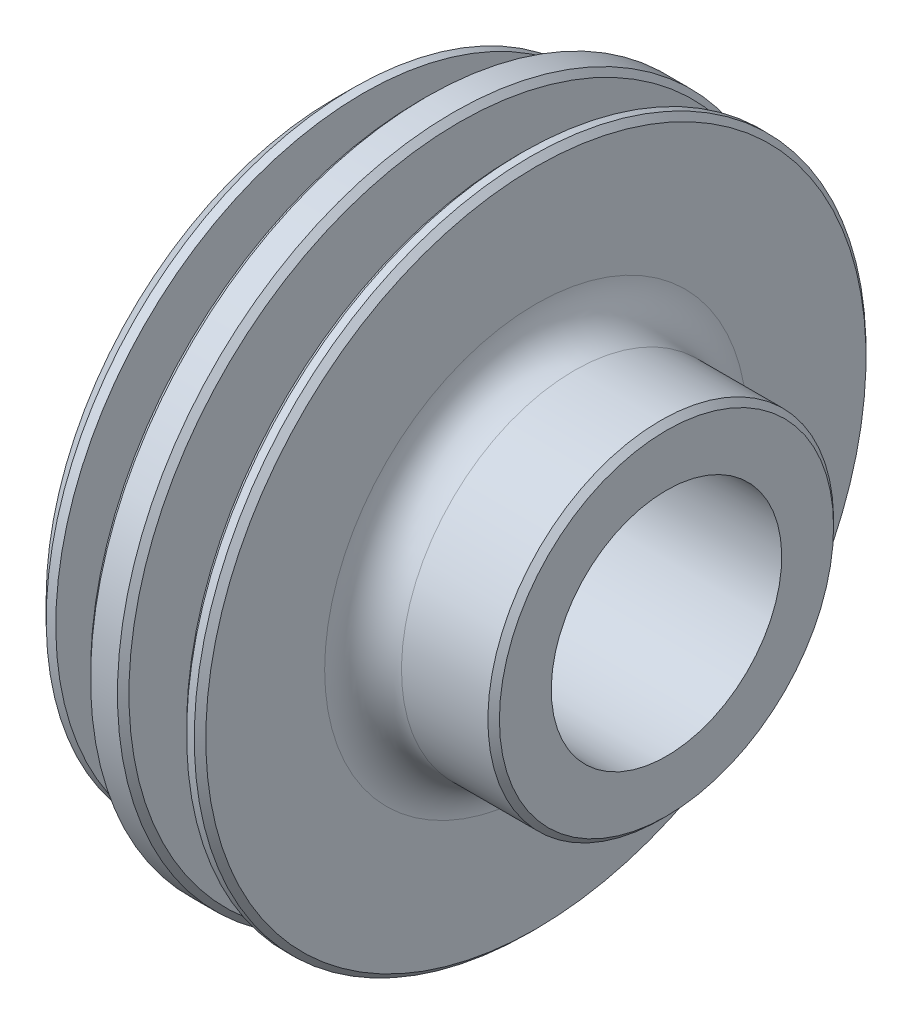
ISO-10303-21;
HEADER;
FILE_DESCRIPTION(('STEP AP214'),'2;1');
FILE_NAME('part.step','',(''),(''),'','','');
FILE_SCHEMA(('AUTOMOTIVE_DESIGN { 1 0 10303 214 1 1 1 1 }'));
ENDSEC;
DATA;
#1=APPLICATION_CONTEXT('core data for automotive mechanical design processes');
#2=APPLICATION_PROTOCOL_DEFINITION('international standard','automotive_design',2000,#1);
#3=PRODUCT_CONTEXT('',#1,'mechanical');
#4=PRODUCT('Part','Part','',(#3));
#5=PRODUCT_RELATED_PRODUCT_CATEGORY('part','',(#4));
#6=PRODUCT_DEFINITION_FORMATION('','',#4);
#7=PRODUCT_DEFINITION_CONTEXT('part definition',#1,'design');
#8=PRODUCT_DEFINITION('design','',#6,#7);
#9=PRODUCT_DEFINITION_SHAPE('','',#8);
#10=(LENGTH_UNIT() NAMED_UNIT(*) SI_UNIT(.MILLI.,.METRE.));
#11=(NAMED_UNIT(*) PLANE_ANGLE_UNIT() SI_UNIT($,.RADIAN.));
#12=(NAMED_UNIT(*) SI_UNIT($,.STERADIAN.) SOLID_ANGLE_UNIT());
#13=UNCERTAINTY_MEASURE_WITH_UNIT(LENGTH_MEASURE(1.E-05),#10,'distance_accuracy_value','');
#14=(GEOMETRIC_REPRESENTATION_CONTEXT(3) GLOBAL_UNCERTAINTY_ASSIGNED_CONTEXT((#13)) GLOBAL_UNIT_ASSIGNED_CONTEXT((#10,
#11,#12)) REPRESENTATION_CONTEXT('',''));
#15=CARTESIAN_POINT('',(0.,0.,0.));
#16=DIRECTION('',(0.,0.,1.));
#17=DIRECTION('',(1.,0.,0.));
#18=AXIS2_PLACEMENT_3D('',#15,#16,#17);
#19=CARTESIAN_POINT('',(7.8,6.00000000000001,0.));
#20=DIRECTION('',(1.,0.,0.));
#21=DIRECTION('',(0.,1.,0.));
#22=AXIS2_PLACEMENT_3D('',#19,#20,#21);
#23=PLANE('',#22);
#24=CARTESIAN_POINT('',(7.8,0.,0.));
#25=DIRECTION('',(1.,0.,0.));
#26=DIRECTION('',(0.,1.,0.));
#27=AXIS2_PLACEMENT_3D('',#24,#25,#26);
#28=CIRCLE('',#27,6.00000000000001);
#29=CARTESIAN_POINT('',(7.8,6.00000000000001,0.));
#30=VERTEX_POINT('',#29);
#31=EDGE_CURVE('E10',#30,#30,#28,.T.);
#32=ORIENTED_EDGE('',*,*,#31,.T.);
#33=EDGE_LOOP('',(#32));
#34=FACE_BOUND('',#33,.T.);
#35=ADVANCED_FACE('F36',(#34),#23,.T.);
#36=CARTESIAN_POINT('',(7.8,0.,0.));
#37=DIRECTION('',(1.,0.,0.));
#38=DIRECTION('',(0.,1.,0.));
#39=AXIS2_PLACEMENT_3D('',#36,#37,#38);
#40=CYLINDRICAL_SURFACE('',#39,6.00000000000001);
#41=CARTESIAN_POINT('',(19.8,0.,0.));
#42=DIRECTION('',(1.,0.,0.));
#43=DIRECTION('',(0.,1.,0.));
#44=AXIS2_PLACEMENT_3D('',#41,#42,#43);
#45=CIRCLE('',#44,6.00000000000001);
#46=CARTESIAN_POINT('',(19.8,6.00000000000001,0.));
#47=VERTEX_POINT('',#46);
#48=EDGE_CURVE('E42',#47,#47,#45,.T.);
#49=ORIENTED_EDGE('',*,*,#48,.T.);
#50=EDGE_LOOP('',(#49));
#51=FACE_BOUND('',#50,.T.);
#52=ORIENTED_EDGE('',*,*,#31,.F.);
#53=EDGE_LOOP('',(#52));
#54=FACE_BOUND('',#53,.T.);
#55=ADVANCED_FACE('F125',(#51,#54),#40,.F.);
#56=CARTESIAN_POINT('',(19.8,8.7,0.));
#57=DIRECTION('',(1.,0.,0.));
#58=DIRECTION('',(0.,1.,0.));
#59=AXIS2_PLACEMENT_3D('',#56,#57,#58);
#60=PLANE('',#59);
#61=CARTESIAN_POINT('',(19.8,0.,0.));
#62=DIRECTION('',(1.,0.,0.));
#63=DIRECTION('',(0.,1.,0.));
#64=AXIS2_PLACEMENT_3D('',#61,#62,#63);
#65=CIRCLE('',#64,8.7);
#66=CARTESIAN_POINT('',(19.8,8.7,0.));
#67=VERTEX_POINT('',#66);
#68=EDGE_CURVE('E46',#67,#67,#65,.T.);
#69=ORIENTED_EDGE('',*,*,#68,.T.);
#70=EDGE_LOOP('',(#69));
#71=FACE_BOUND('',#70,.T.);
#72=ORIENTED_EDGE('',*,*,#48,.F.);
#73=EDGE_LOOP('',(#72));
#74=FACE_BOUND('',#73,.T.);
#75=ADVANCED_FACE('F129',(#71,#74),#60,.T.);
#76=CARTESIAN_POINT('',(19.8,0.,0.));
#77=DIRECTION('',(-1.,0.,0.));
#78=DIRECTION('',(0.,-1.,0.));
#79=AXIS2_PLACEMENT_3D('',#76,#77,#78);
#80=CONICAL_SURFACE('',#79,8.7,0.785398163397434);
#81=CARTESIAN_POINT('',(19.5,0.,0.));
#82=DIRECTION('',(1.,0.,0.));
#83=DIRECTION('',(0.,1.,0.));
#84=AXIS2_PLACEMENT_3D('',#81,#82,#83);
#85=CIRCLE('',#84,9.);
#86=CARTESIAN_POINT('',(19.5,9.,0.));
#87=VERTEX_POINT('',#86);
#88=EDGE_CURVE('E50',#87,#87,#85,.T.);
#89=ORIENTED_EDGE('',*,*,#88,.T.);
#90=EDGE_LOOP('',(#89));
#91=FACE_BOUND('',#90,.T.);
#92=ORIENTED_EDGE('',*,*,#68,.F.);
#93=EDGE_LOOP('',(#92));
#94=FACE_BOUND('',#93,.T.);
#95=ADVANCED_FACE('F133',(#91,#94),#80,.T.);
#96=CARTESIAN_POINT('',(7.8,0.,0.));
#97=DIRECTION('',(1.,0.,0.));
#98=DIRECTION('',(0.,1.,0.));
#99=AXIS2_PLACEMENT_3D('',#96,#97,#98);
#100=CYLINDRICAL_SURFACE('',#99,9.);
#101=CARTESIAN_POINT('',(15.,0.,0.));
#102=DIRECTION('',(1.,0.,0.));
#103=DIRECTION('',(0.,1.,0.));
#104=AXIS2_PLACEMENT_3D('',#101,#102,#103);
#105=CIRCLE('',#104,9.);
#106=CARTESIAN_POINT('',(15.,9.,0.));
#107=VERTEX_POINT('',#106);
#108=EDGE_CURVE('E55',#107,#107,#105,.T.);
#109=ORIENTED_EDGE('',*,*,#108,.T.);
#110=EDGE_LOOP('',(#109));
#111=FACE_BOUND('',#110,.T.);
#112=ORIENTED_EDGE('',*,*,#88,.F.);
#113=EDGE_LOOP('',(#112));
#114=FACE_BOUND('',#113,.T.);
#115=ADVANCED_FACE('F140',(#111,#114),#100,.T.);
#116=CARTESIAN_POINT('',(15.,0.,0.));
#117=DIRECTION('',(1.,0.,0.));
#118=DIRECTION('',(0.,1.,0.));
#119=AXIS2_PLACEMENT_3D('',#116,#117,#118);
#120=TOROIDAL_SURFACE('',#119,11.,2.);
#121=CARTESIAN_POINT('',(13.,0.,0.));
#122=DIRECTION('',(1.,0.,0.));
#123=DIRECTION('',(0.,1.,0.));
#124=AXIS2_PLACEMENT_3D('',#121,#122,#123);
#125=CIRCLE('',#124,11.);
#126=CARTESIAN_POINT('',(13.,11.,0.));
#127=VERTEX_POINT('',#126);
#128=EDGE_CURVE('E58',#127,#127,#125,.T.);
#129=ORIENTED_EDGE('',*,*,#128,.T.);
#130=EDGE_LOOP('',(#129));
#131=FACE_BOUND('',#130,.T.);
#132=ORIENTED_EDGE('',*,*,#108,.F.);
#133=EDGE_LOOP('',(#132));
#134=FACE_BOUND('',#133,.T.);
#135=ADVANCED_FACE('F144',(#131,#134),#120,.F.);
#136=CARTESIAN_POINT('',(13.,17.1896462898336,0.));
#137=DIRECTION('',(1.,0.,0.));
#138=DIRECTION('',(0.,1.,0.));
#139=AXIS2_PLACEMENT_3D('',#136,#137,#138);
#140=PLANE('',#139);
#141=CARTESIAN_POINT('',(13.,0.,0.));
#142=DIRECTION('',(1.,0.,0.));
#143=DIRECTION('',(0.,1.,0.));
#144=AXIS2_PLACEMENT_3D('',#141,#142,#143);
#145=CIRCLE('',#144,17.1896462898336);
#146=CARTESIAN_POINT('',(13.,17.1896462898336,0.));
#147=VERTEX_POINT('',#146);
#148=EDGE_CURVE('E61',#147,#147,#145,.T.);
#149=ORIENTED_EDGE('',*,*,#148,.T.);
#150=EDGE_LOOP('',(#149));
#151=FACE_BOUND('',#150,.T.);
#152=ORIENTED_EDGE('',*,*,#128,.F.);
#153=EDGE_LOOP('',(#152));
#154=FACE_BOUND('',#153,.T.);
#155=ADVANCED_FACE('F148',(#151,#154),#140,.T.);
#156=CARTESIAN_POINT('',(13.,0.,0.));
#157=DIRECTION('',(-1.,0.,0.));
#158=DIRECTION('',(0.,-1.,0.));
#159=AXIS2_PLACEMENT_3D('',#156,#157,#158);
#160=CONICAL_SURFACE('',#159,17.1896462898336,0.785398163397437);
#161=CARTESIAN_POINT('',(12.7,0.,0.));
#162=DIRECTION('',(1.,0.,0.));
#163=DIRECTION('',(0.,1.,0.));
#164=AXIS2_PLACEMENT_3D('',#161,#162,#163);
#165=CIRCLE('',#164,17.4896462898336);
#166=CARTESIAN_POINT('',(12.7,17.4896462898336,0.));
#167=VERTEX_POINT('',#166);
#168=EDGE_CURVE('E64',#167,#167,#165,.T.);
#169=ORIENTED_EDGE('',*,*,#168,.T.);
#170=EDGE_LOOP('',(#169));
#171=FACE_BOUND('',#170,.T.);
#172=ORIENTED_EDGE('',*,*,#148,.F.);
#173=EDGE_LOOP('',(#172));
#174=FACE_BOUND('',#173,.T.);
#175=ADVANCED_FACE('F152',(#171,#174),#160,.T.);
#176=CARTESIAN_POINT('',(7.8,0.,0.));
#177=DIRECTION('',(1.,0.,0.));
#178=DIRECTION('',(0.,1.,0.));
#179=AXIS2_PLACEMENT_3D('',#176,#177,#178);
#180=CYLINDRICAL_SURFACE('',#179,17.4896462898336);
#181=CARTESIAN_POINT('',(12.3,0.,0.));
#182=DIRECTION('',(1.,0.,0.));
#183=DIRECTION('',(0.,1.,0.));
#184=AXIS2_PLACEMENT_3D('',#181,#182,#183);
#185=CIRCLE('',#184,17.4896462898336);
#186=CARTESIAN_POINT('',(12.3,17.4896462898336,0.));
#187=VERTEX_POINT('',#186);
#188=EDGE_CURVE('E67',#187,#187,#185,.T.);
#189=ORIENTED_EDGE('',*,*,#188,.T.);
#190=EDGE_LOOP('',(#189));
#191=FACE_BOUND('',#190,.T.);
#192=ORIENTED_EDGE('',*,*,#168,.F.);
#193=EDGE_LOOP('',(#192));
#194=FACE_BOUND('',#193,.T.);
#195=ADVANCED_FACE('F156',(#191,#194),#180,.T.);
#196=CARTESIAN_POINT('',(12.3,0.,0.));
#197=DIRECTION('',(1.,0.,0.));
#198=DIRECTION('',(0.,1.,0.));
#199=AXIS2_PLACEMENT_3D('',#196,#197,#198);
#200=CONICAL_SURFACE('',#199,17.4896462898336,0.785398163397443);
#201=CARTESIAN_POINT('',(12.,0.,0.));
#202=DIRECTION('',(1.,0.,0.));
#203=DIRECTION('',(0.,1.,0.));
#204=AXIS2_PLACEMENT_3D('',#201,#202,#203);
#205=CIRCLE('',#204,17.1896462898336);
#206=CARTESIAN_POINT('',(12.,17.1896462898336,0.));
#207=VERTEX_POINT('',#206);
#208=EDGE_CURVE('E70',#207,#207,#205,.T.);
#209=ORIENTED_EDGE('',*,*,#208,.T.);
#210=EDGE_LOOP('',(#209));
#211=FACE_BOUND('',#210,.T.);
#212=ORIENTED_EDGE('',*,*,#188,.F.);
#213=EDGE_LOOP('',(#212));
#214=FACE_BOUND('',#213,.T.);
#215=ADVANCED_FACE('F160',(#211,#214),#200,.T.);
#216=CARTESIAN_POINT('',(12.,12.,0.));
#217=DIRECTION('',(-1.,0.,0.));
#218=DIRECTION('',(0.,-1.,0.));
#219=AXIS2_PLACEMENT_3D('',#216,#217,#218);
#220=PLANE('',#219);
#221=CARTESIAN_POINT('',(12.,0.,0.));
#222=DIRECTION('',(1.,0.,0.));
#223=DIRECTION('',(0.,1.,0.));
#224=AXIS2_PLACEMENT_3D('',#221,#222,#223);
#225=CIRCLE('',#224,12.);
#226=CARTESIAN_POINT('',(12.,12.,0.));
#227=VERTEX_POINT('',#226);
#228=EDGE_CURVE('E73',#227,#227,#225,.T.);
#229=ORIENTED_EDGE('',*,*,#228,.T.);
#230=EDGE_LOOP('',(#229));
#231=FACE_BOUND('',#230,.T.);
#232=ORIENTED_EDGE('',*,*,#208,.F.);
#233=EDGE_LOOP('',(#232));
#234=FACE_BOUND('',#233,.T.);
#235=ADVANCED_FACE('F164',(#231,#234),#220,.T.);
#236=CARTESIAN_POINT('',(7.8,0.,0.));
#237=DIRECTION('',(1.,0.,0.));
#238=DIRECTION('',(0.,1.,0.));
#239=AXIS2_PLACEMENT_3D('',#236,#237,#238);
#240=CYLINDRICAL_SURFACE('',#239,12.);
#241=CARTESIAN_POINT('',(8.99999999999999,0.,0.));
#242=DIRECTION('',(1.,0.,0.));
#243=DIRECTION('',(0.,1.,0.));
#244=AXIS2_PLACEMENT_3D('',#241,#242,#243);
#245=CIRCLE('',#244,12.);
#246=CARTESIAN_POINT('',(9.,12.,0.));
#247=VERTEX_POINT('',#246);
#248=EDGE_CURVE('E76',#247,#247,#245,.T.);
#249=ORIENTED_EDGE('',*,*,#248,.T.);
#250=EDGE_LOOP('',(#249));
#251=FACE_BOUND('',#250,.T.);
#252=ORIENTED_EDGE('',*,*,#228,.F.);
#253=EDGE_LOOP('',(#252));
#254=FACE_BOUND('',#253,.T.);
#255=ADVANCED_FACE('F168',(#251,#254),#240,.T.);
#256=CARTESIAN_POINT('',(9.,17.1896462898336,0.));
#257=DIRECTION('',(1.,0.,0.));
#258=DIRECTION('',(0.,1.,0.));
#259=AXIS2_PLACEMENT_3D('',#256,#257,#258);
#260=PLANE('',#259);
#261=CARTESIAN_POINT('',(8.99999999999999,0.,0.));
#262=DIRECTION('',(1.,0.,0.));
#263=DIRECTION('',(0.,1.,0.));
#264=AXIS2_PLACEMENT_3D('',#261,#262,#263);
#265=CIRCLE('',#264,17.1896462898336);
#266=CARTESIAN_POINT('',(9.,17.1896462898336,0.));
#267=VERTEX_POINT('',#266);
#268=EDGE_CURVE('E79',#267,#267,#265,.T.);
#269=ORIENTED_EDGE('',*,*,#268,.T.);
#270=EDGE_LOOP('',(#269));
#271=FACE_BOUND('',#270,.T.);
#272=ORIENTED_EDGE('',*,*,#248,.F.);
#273=EDGE_LOOP('',(#272));
#274=FACE_BOUND('',#273,.T.);
#275=ADVANCED_FACE('F172',(#271,#274),#260,.T.);
#276=CARTESIAN_POINT('',(8.99999999999999,0.,0.));
#277=DIRECTION('',(-1.,0.,0.));
#278=DIRECTION('',(0.,-1.,0.));
#279=AXIS2_PLACEMENT_3D('',#276,#277,#278);
#280=CONICAL_SURFACE('',#279,17.1896462898336,0.785398163397443);
#281=CARTESIAN_POINT('',(8.69999999999999,0.,0.));
#282=DIRECTION('',(1.,0.,0.));
#283=DIRECTION('',(0.,1.,0.));
#284=AXIS2_PLACEMENT_3D('',#281,#282,#283);
#285=CIRCLE('',#284,17.4896462898336);
#286=CARTESIAN_POINT('',(8.7,17.4896462898336,0.));
#287=VERTEX_POINT('',#286);
#288=EDGE_CURVE('E82',#287,#287,#285,.T.);
#289=ORIENTED_EDGE('',*,*,#288,.T.);
#290=EDGE_LOOP('',(#289));
#291=FACE_BOUND('',#290,.T.);
#292=ORIENTED_EDGE('',*,*,#268,.F.);
#293=EDGE_LOOP('',(#292));
#294=FACE_BOUND('',#293,.T.);
#295=ADVANCED_FACE('F176',(#291,#294),#280,.T.);
#296=CARTESIAN_POINT('',(7.8,0.,0.));
#297=DIRECTION('',(1.,0.,0.));
#298=DIRECTION('',(0.,1.,0.));
#299=AXIS2_PLACEMENT_3D('',#296,#297,#298);
#300=CYLINDRICAL_SURFACE('',#299,17.4896462898336);
#301=CARTESIAN_POINT('',(7.29999999999999,0.,0.));
#302=DIRECTION('',(1.,0.,0.));
#303=DIRECTION('',(0.,1.,0.));
#304=AXIS2_PLACEMENT_3D('',#301,#302,#303);
#305=CIRCLE('',#304,17.4896462898336);
#306=CARTESIAN_POINT('',(7.29999999999999,17.4896462898336,0.));
#307=VERTEX_POINT('',#306);
#308=EDGE_CURVE('E85',#307,#307,#305,.T.);
#309=ORIENTED_EDGE('',*,*,#308,.T.);
#310=EDGE_LOOP('',(#309));
#311=FACE_BOUND('',#310,.T.);
#312=ORIENTED_EDGE('',*,*,#288,.F.);
#313=EDGE_LOOP('',(#312));
#314=FACE_BOUND('',#313,.T.);
#315=ADVANCED_FACE('F180',(#311,#314),#300,.T.);
#316=CARTESIAN_POINT('',(7.29999999999999,0.,0.));
#317=DIRECTION('',(1.,0.,0.));
#318=DIRECTION('',(0.,1.,0.));
#319=AXIS2_PLACEMENT_3D('',#316,#317,#318);
#320=CONICAL_SURFACE('',#319,17.4896462898336,0.785398163397451);
#321=CARTESIAN_POINT('',(6.99999999999999,0.,0.));
#322=DIRECTION('',(1.,0.,0.));
#323=DIRECTION('',(0.,1.,0.));
#324=AXIS2_PLACEMENT_3D('',#321,#322,#323);
#325=CIRCLE('',#324,17.1896462898336);
#326=CARTESIAN_POINT('',(6.99999999999999,17.1896462898336,0.));
#327=VERTEX_POINT('',#326);
#328=EDGE_CURVE('E88',#327,#327,#325,.T.);
#329=ORIENTED_EDGE('',*,*,#328,.T.);
#330=EDGE_LOOP('',(#329));
#331=FACE_BOUND('',#330,.T.);
#332=ORIENTED_EDGE('',*,*,#308,.F.);
#333=EDGE_LOOP('',(#332));
#334=FACE_BOUND('',#333,.T.);
#335=ADVANCED_FACE('F184',(#331,#334),#320,.T.);
#336=CARTESIAN_POINT('',(6.99999999999999,11.5,0.));
#337=DIRECTION('',(-1.,0.,0.));
#338=DIRECTION('',(0.,-1.,0.));
#339=AXIS2_PLACEMENT_3D('',#336,#337,#338);
#340=PLANE('',#339);
#341=CARTESIAN_POINT('',(6.99999999999999,0.,0.));
#342=DIRECTION('',(1.,0.,0.));
#343=DIRECTION('',(0.,1.,0.));
#344=AXIS2_PLACEMENT_3D('',#341,#342,#343);
#345=CIRCLE('',#344,11.5);
#346=CARTESIAN_POINT('',(6.99999999999999,11.5,0.));
#347=VERTEX_POINT('',#346);
#348=EDGE_CURVE('E91',#347,#347,#345,.T.);
#349=ORIENTED_EDGE('',*,*,#348,.T.);
#350=EDGE_LOOP('',(#349));
#351=FACE_BOUND('',#350,.T.);
#352=ORIENTED_EDGE('',*,*,#328,.F.);
#353=EDGE_LOOP('',(#352));
#354=FACE_BOUND('',#353,.T.);
#355=ADVANCED_FACE('F188',(#351,#354),#340,.T.);
#356=CARTESIAN_POINT('',(7.8,0.,0.));
#357=DIRECTION('',(1.,0.,0.));
#358=DIRECTION('',(0.,1.,0.));
#359=AXIS2_PLACEMENT_3D('',#356,#357,#358);
#360=CYLINDRICAL_SURFACE('',#359,11.5);
#361=CARTESIAN_POINT('',(3.99999999999999,0.,0.));
#362=DIRECTION('',(1.,0.,0.));
#363=DIRECTION('',(0.,1.,0.));
#364=AXIS2_PLACEMENT_3D('',#361,#362,#363);
#365=CIRCLE('',#364,11.5);
#366=CARTESIAN_POINT('',(3.99999999999999,11.5,0.));
#367=VERTEX_POINT('',#366);
#368=EDGE_CURVE('E94',#367,#367,#365,.T.);
#369=ORIENTED_EDGE('',*,*,#368,.T.);
#370=EDGE_LOOP('',(#369));
#371=FACE_BOUND('',#370,.T.);
#372=ORIENTED_EDGE('',*,*,#348,.F.);
#373=EDGE_LOOP('',(#372));
#374=FACE_BOUND('',#373,.T.);
#375=ADVANCED_FACE('F192',(#371,#374),#360,.T.);
#376=CARTESIAN_POINT('',(3.99999999999999,16.,0.));
#377=DIRECTION('',(1.,0.,0.));
#378=DIRECTION('',(0.,1.,0.));
#379=AXIS2_PLACEMENT_3D('',#376,#377,#378);
#380=PLANE('',#379);
#381=CARTESIAN_POINT('',(3.99999999999999,0.,0.));
#382=DIRECTION('',(1.,0.,0.));
#383=DIRECTION('',(0.,1.,0.));
#384=AXIS2_PLACEMENT_3D('',#381,#382,#383);
#385=CIRCLE('',#384,16.);
#386=CARTESIAN_POINT('',(3.99999999999999,16.,0.));
#387=VERTEX_POINT('',#386);
#388=EDGE_CURVE('E97',#387,#387,#385,.T.);
#389=ORIENTED_EDGE('',*,*,#388,.T.);
#390=EDGE_LOOP('',(#389));
#391=FACE_BOUND('',#390,.T.);
#392=ORIENTED_EDGE('',*,*,#368,.F.);
#393=EDGE_LOOP('',(#392));
#394=FACE_BOUND('',#393,.T.);
#395=ADVANCED_FACE('F196',(#391,#394),#380,.T.);
#396=CARTESIAN_POINT('',(7.8,0.,0.));
#397=DIRECTION('',(1.,0.,0.));
#398=DIRECTION('',(0.,1.,0.));
#399=AXIS2_PLACEMENT_3D('',#396,#397,#398);
#400=CYLINDRICAL_SURFACE('',#399,16.);
#401=CARTESIAN_POINT('',(3.5,0.,0.));
#402=DIRECTION('',(1.,0.,0.));
#403=DIRECTION('',(0.,1.,0.));
#404=AXIS2_PLACEMENT_3D('',#401,#402,#403);
#405=CIRCLE('',#404,16.);
#406=CARTESIAN_POINT('',(3.5,16.,0.));
#407=VERTEX_POINT('',#406);
#408=EDGE_CURVE('E100',#407,#407,#405,.T.);
#409=ORIENTED_EDGE('',*,*,#408,.T.);
#410=EDGE_LOOP('',(#409));
#411=FACE_BOUND('',#410,.T.);
#412=ORIENTED_EDGE('',*,*,#388,.F.);
#413=EDGE_LOOP('',(#412));
#414=FACE_BOUND('',#413,.T.);
#415=ADVANCED_FACE('F200',(#411,#414),#400,.T.);
#416=CARTESIAN_POINT('',(3.5,0.,0.));
#417=DIRECTION('',(1.,0.,0.));
#418=DIRECTION('',(0.,1.,0.));
#419=AXIS2_PLACEMENT_3D('',#416,#417,#418);
#420=CONICAL_SURFACE('',#419,16.,0.785398163397446);
#421=CARTESIAN_POINT('',(2.49999999999999,0.,0.));
#422=DIRECTION('',(1.,0.,0.));
#423=DIRECTION('',(0.,1.,0.));
#424=AXIS2_PLACEMENT_3D('',#421,#422,#423);
#425=CIRCLE('',#424,15.);
#426=CARTESIAN_POINT('',(2.5,15.,0.));
#427=VERTEX_POINT('',#426);
#428=EDGE_CURVE('E103',#427,#427,#425,.T.);
#429=ORIENTED_EDGE('',*,*,#428,.T.);
#430=EDGE_LOOP('',(#429));
#431=FACE_BOUND('',#430,.T.);
#432=ORIENTED_EDGE('',*,*,#408,.F.);
#433=EDGE_LOOP('',(#432));
#434=FACE_BOUND('',#433,.T.);
#435=ADVANCED_FACE('F204',(#431,#434),#420,.T.);
#436=CARTESIAN_POINT('',(2.5,11.,0.));
#437=DIRECTION('',(-1.,0.,0.));
#438=DIRECTION('',(0.,-1.,0.));
#439=AXIS2_PLACEMENT_3D('',#436,#437,#438);
#440=PLANE('',#439);
#441=CARTESIAN_POINT('',(2.49999999999999,0.,0.));
#442=DIRECTION('',(1.,0.,0.));
#443=DIRECTION('',(0.,1.,0.));
#444=AXIS2_PLACEMENT_3D('',#441,#442,#443);
#445=CIRCLE('',#444,11.);
#446=CARTESIAN_POINT('',(2.5,11.,0.));
#447=VERTEX_POINT('',#446);
#448=EDGE_CURVE('E106',#447,#447,#445,.T.);
#449=ORIENTED_EDGE('',*,*,#448,.T.);
#450=EDGE_LOOP('',(#449));
#451=FACE_BOUND('',#450,.T.);
#452=ORIENTED_EDGE('',*,*,#428,.F.);
#453=EDGE_LOOP('',(#452));
#454=FACE_BOUND('',#453,.T.);
#455=ADVANCED_FACE('F122',(#451,#454),#440,.T.);
#456=CARTESIAN_POINT('',(2.49999999999999,0.,0.));
#457=DIRECTION('',(1.,0.,0.));
#458=DIRECTION('',(0.,1.,0.));
#459=AXIS2_PLACEMENT_3D('',#456,#457,#458);
#460=CONICAL_SURFACE('',#459,11.,0.785398163397448);
#461=CARTESIAN_POINT('',(0.,0.,0.));
#462=DIRECTION('',(1.,0.,0.));
#463=DIRECTION('',(0.,1.,0.));
#464=AXIS2_PLACEMENT_3D('',#461,#462,#463);
#465=CIRCLE('',#464,8.5);
#466=CARTESIAN_POINT('',(0.,8.5,0.));
#467=VERTEX_POINT('',#466);
#468=EDGE_CURVE('E109',#467,#467,#465,.T.);
#469=ORIENTED_EDGE('',*,*,#468,.T.);
#470=EDGE_LOOP('',(#469));
#471=FACE_BOUND('',#470,.T.);
#472=ORIENTED_EDGE('',*,*,#448,.F.);
#473=EDGE_LOOP('',(#472));
#474=FACE_BOUND('',#473,.T.);
#475=ADVANCED_FACE('F113',(#471,#474),#460,.T.);
#476=CARTESIAN_POINT('',(0.,0.,0.));
#477=DIRECTION('',(-1.,0.,0.));
#478=DIRECTION('',(0.,-1.,0.));
#479=AXIS2_PLACEMENT_3D('',#476,#477,#478);
#480=PLANE('',#479);
#481=ORIENTED_EDGE('',*,*,#468,.F.);
#482=EDGE_LOOP('',(#481));
#483=FACE_BOUND('',#482,.T.);
#484=ADVANCED_FACE('F116',(#483),#480,.T.);
#485=CLOSED_SHELL('',(#35,#55,#75,#95,#115,#135,#155,#175,#195,#215,#235,#255,#275,#295,#315,
#335,#355,#375,#395,#415,#435,#455,#475,#484));
#486=MANIFOLD_SOLID_BREP('B2',#485);
#487=ADVANCED_BREP_SHAPE_REPRESENTATION('',(#18,#486),#14);
#488=SHAPE_DEFINITION_REPRESENTATION(#9,#487);
ENDSEC;
END-ISO-10303-21;
